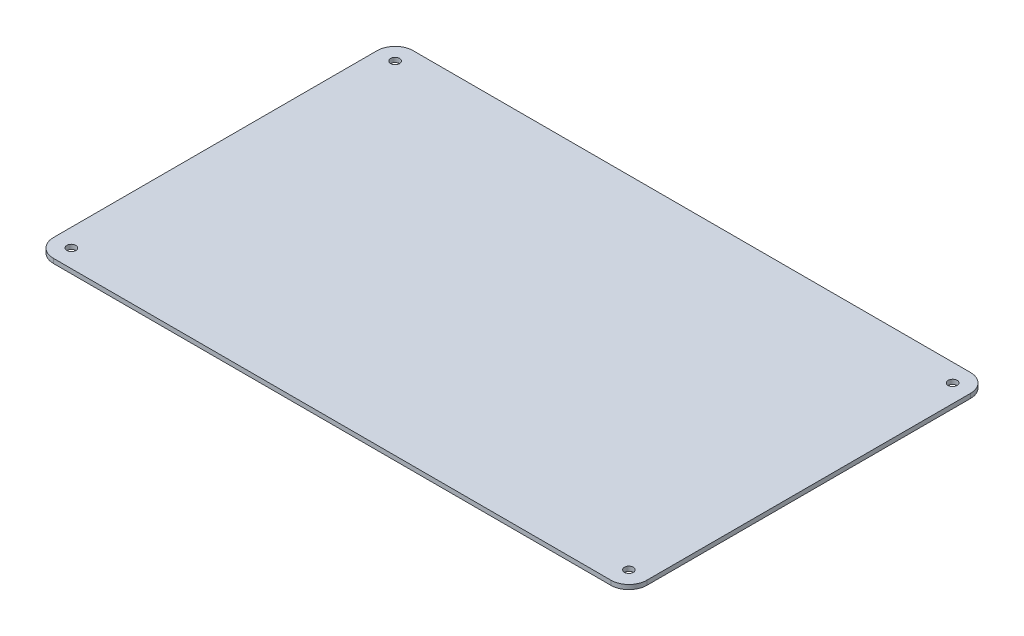
ISO-10303-21;
HEADER;
FILE_DESCRIPTION(('STEP AP214'),'2;1');
FILE_NAME('part.step','',(''),(''),'','','');
FILE_SCHEMA(('AUTOMOTIVE_DESIGN { 1 0 10303 214 1 1 1 1 }'));
ENDSEC;
DATA;
#1=APPLICATION_CONTEXT('core data for automotive mechanical design processes');
#2=APPLICATION_PROTOCOL_DEFINITION('international standard','automotive_design',2000,#1);
#3=PRODUCT_CONTEXT('',#1,'mechanical');
#4=PRODUCT('Part','Part','',(#3));
#5=PRODUCT_RELATED_PRODUCT_CATEGORY('part','',(#4));
#6=PRODUCT_DEFINITION_FORMATION('','',#4);
#7=PRODUCT_DEFINITION_CONTEXT('part definition',#1,'design');
#8=PRODUCT_DEFINITION('design','',#6,#7);
#9=PRODUCT_DEFINITION_SHAPE('','',#8);
#10=(LENGTH_UNIT() NAMED_UNIT(*) SI_UNIT(.MILLI.,.METRE.));
#11=(NAMED_UNIT(*) PLANE_ANGLE_UNIT() SI_UNIT($,.RADIAN.));
#12=(NAMED_UNIT(*) SI_UNIT($,.STERADIAN.) SOLID_ANGLE_UNIT());
#13=UNCERTAINTY_MEASURE_WITH_UNIT(LENGTH_MEASURE(1.E-05),#10,'distance_accuracy_value','');
#14=(GEOMETRIC_REPRESENTATION_CONTEXT(3) GLOBAL_UNCERTAINTY_ASSIGNED_CONTEXT((#13)) GLOBAL_UNIT_ASSIGNED_CONTEXT((#10,
#11,#12)) REPRESENTATION_CONTEXT('',''));
#15=CARTESIAN_POINT('',(0.,0.,0.));
#16=DIRECTION('',(0.,0.,1.));
#17=DIRECTION('',(1.,0.,0.));
#18=AXIS2_PLACEMENT_3D('',#15,#16,#17);
#19=CARTESIAN_POINT('',(6.35,1.5875,-6.35));
#20=DIRECTION('',(0.,1.,0.));
#21=DIRECTION('',(0.,0.,1.));
#22=AXIS2_PLACEMENT_3D('',#19,#20,#21);
#23=PLANE('',#22);
#24=CARTESIAN_POINT('',(203.2,1.5875,-6.35));
#25=DIRECTION('',(0.,1.,0.));
#26=DIRECTION('',(0.,0.,1.));
#27=AXIS2_PLACEMENT_3D('',#24,#25,#26);
#28=CIRCLE('',#27,1.58749999999999);
#29=CARTESIAN_POINT('',(203.2,1.5875,-4.76250000000002));
#30=VERTEX_POINT('',#29);
#31=EDGE_CURVE('E188',#30,#30,#28,.T.);
#32=ORIENTED_EDGE('',*,*,#31,.F.);
#33=EDGE_LOOP('',(#32));
#34=FACE_BOUND('',#33,.T.);
#35=CARTESIAN_POINT('',(6.35,1.5875,-120.65));
#36=DIRECTION('',(0.,1.,0.));
#37=DIRECTION('',(0.,0.,1.));
#38=AXIS2_PLACEMENT_3D('',#35,#36,#37);
#39=CIRCLE('',#38,1.5875);
#40=CARTESIAN_POINT('',(6.35,1.5875,-119.0625));
#41=VERTEX_POINT('',#40);
#42=EDGE_CURVE('E134',#41,#41,#39,.T.);
#43=ORIENTED_EDGE('',*,*,#42,.F.);
#44=EDGE_LOOP('',(#43));
#45=FACE_BOUND('',#44,.T.);
#46=CARTESIAN_POINT('',(6.35,1.5875,-6.35));
#47=DIRECTION('',(0.,1.,0.));
#48=DIRECTION('',(0.,0.,1.));
#49=AXIS2_PLACEMENT_3D('',#46,#47,#48);
#50=CIRCLE('',#49,6.35);
#51=CARTESIAN_POINT('',(0.,1.5875,-6.35000000000004));
#52=VERTEX_POINT('',#51);
#53=CARTESIAN_POINT('',(6.35000000000004,1.5875,0.));
#54=VERTEX_POINT('',#53);
#55=EDGE_CURVE('E145',#52,#54,#50,.T.);
#56=ORIENTED_EDGE('',*,*,#55,.T.);
#57=DIRECTION('',(1.,0.,0.));
#58=VECTOR('',#57,1.);
#59=CARTESIAN_POINT('',(6.35000000000004,1.5875,0.));
#60=LINE('',#59,#58);
#61=CARTESIAN_POINT('',(203.2,1.5875,0.));
#62=VERTEX_POINT('',#61);
#63=EDGE_CURVE('E93',#54,#62,#60,.T.);
#64=ORIENTED_EDGE('',*,*,#63,.T.);
#65=CARTESIAN_POINT('',(203.2,1.5875,-6.35));
#66=DIRECTION('',(0.,1.,0.));
#67=DIRECTION('',(0.,0.,1.));
#68=AXIS2_PLACEMENT_3D('',#65,#66,#67);
#69=CIRCLE('',#68,6.35);
#70=CARTESIAN_POINT('',(209.55,1.5875,-6.35000000000004));
#71=VERTEX_POINT('',#70);
#72=EDGE_CURVE('E160',#62,#71,#69,.T.);
#73=ORIENTED_EDGE('',*,*,#72,.T.);
#74=DIRECTION('',(0.,0.,-1.));
#75=VECTOR('',#74,1.);
#76=CARTESIAN_POINT('',(209.55,1.5875,-6.35000000000004));
#77=LINE('',#76,#75);
#78=CARTESIAN_POINT('',(209.55,1.5875,-120.65));
#79=VERTEX_POINT('',#78);
#80=EDGE_CURVE('E173',#71,#79,#77,.T.);
#81=ORIENTED_EDGE('',*,*,#80,.T.);
#82=CARTESIAN_POINT('',(203.2,1.5875,-120.65));
#83=DIRECTION('',(0.,1.,0.));
#84=DIRECTION('',(0.,0.,1.));
#85=AXIS2_PLACEMENT_3D('',#82,#83,#84);
#86=CIRCLE('',#85,6.34999999999999);
#87=CARTESIAN_POINT('',(203.2,1.5875,-127.));
#88=VERTEX_POINT('',#87);
#89=EDGE_CURVE('E112',#79,#88,#86,.T.);
#90=ORIENTED_EDGE('',*,*,#89,.T.);
#91=DIRECTION('',(-1.,0.,0.));
#92=VECTOR('',#91,1.);
#93=CARTESIAN_POINT('',(6.35000000000004,1.5875,-127.));
#94=LINE('',#93,#92);
#95=CARTESIAN_POINT('',(6.35000000000005,1.5875,-127.));
#96=VERTEX_POINT('',#95);
#97=EDGE_CURVE('E106',#88,#96,#94,.T.);
#98=ORIENTED_EDGE('',*,*,#97,.T.);
#99=CARTESIAN_POINT('',(6.35,1.5875,-120.65));
#100=DIRECTION('',(0.,1.,0.));
#101=DIRECTION('',(0.,0.,1.));
#102=AXIS2_PLACEMENT_3D('',#99,#100,#101);
#103=CIRCLE('',#102,6.35);
#104=CARTESIAN_POINT('',(0.,1.5875,-120.65));
#105=VERTEX_POINT('',#104);
#106=EDGE_CURVE('E110',#96,#105,#103,.T.);
#107=ORIENTED_EDGE('',*,*,#106,.T.);
#108=DIRECTION('',(0.,0.,1.));
#109=VECTOR('',#108,1.);
#110=CARTESIAN_POINT('',(0.,1.5875,-6.35000000000004));
#111=LINE('',#110,#109);
#112=EDGE_CURVE('E50',#105,#52,#111,.T.);
#113=ORIENTED_EDGE('',*,*,#112,.T.);
#114=EDGE_LOOP('',(#56,#64,#73,#81,#90,#98,#107,#113));
#115=FACE_BOUND('',#114,.T.);
#116=CARTESIAN_POINT('',(203.2,1.5875,-120.65));
#117=DIRECTION('',(0.,1.,0.));
#118=DIRECTION('',(0.,0.,1.));
#119=AXIS2_PLACEMENT_3D('',#116,#117,#118);
#120=CIRCLE('',#119,1.58749999999999);
#121=CARTESIAN_POINT('',(203.2,1.5875,-119.0625));
#122=VERTEX_POINT('',#121);
#123=EDGE_CURVE('E182',#122,#122,#120,.T.);
#124=ORIENTED_EDGE('',*,*,#123,.F.);
#125=EDGE_LOOP('',(#124));
#126=FACE_BOUND('',#125,.T.);
#127=CARTESIAN_POINT('',(6.35,1.5875,-6.35));
#128=DIRECTION('',(0.,1.,0.));
#129=DIRECTION('',(0.,0.,1.));
#130=AXIS2_PLACEMENT_3D('',#127,#128,#129);
#131=CIRCLE('',#130,1.5875);
#132=CARTESIAN_POINT('',(6.35,1.5875,-4.7625));
#133=VERTEX_POINT('',#132);
#134=EDGE_CURVE('E194',#133,#133,#131,.T.);
#135=ORIENTED_EDGE('',*,*,#134,.F.);
#136=EDGE_LOOP('',(#135));
#137=FACE_BOUND('',#136,.T.);
#138=ADVANCED_FACE('F33',(#34,#45,#115,#126,#137),#23,.T.);
#139=CARTESIAN_POINT('',(6.35,0.,-6.35));
#140=DIRECTION('',(0.,1.,0.));
#141=DIRECTION('',(0.,0.,1.));
#142=AXIS2_PLACEMENT_3D('',#139,#140,#141);
#143=PLANE('',#142);
#144=CARTESIAN_POINT('',(6.35,0.,-6.35));
#145=DIRECTION('',(0.,1.,0.));
#146=DIRECTION('',(0.,0.,1.));
#147=AXIS2_PLACEMENT_3D('',#144,#145,#146);
#148=CIRCLE('',#147,6.35);
#149=CARTESIAN_POINT('',(0.,0.,-6.35000000000004));
#150=VERTEX_POINT('',#149);
#151=CARTESIAN_POINT('',(6.35000000000004,0.,0.));
#152=VERTEX_POINT('',#151);
#153=EDGE_CURVE('E130',#150,#152,#148,.T.);
#154=ORIENTED_EDGE('',*,*,#153,.F.);
#155=DIRECTION('',(0.,0.,1.));
#156=VECTOR('',#155,1.);
#157=CARTESIAN_POINT('',(0.,0.,-6.35000000000004));
#158=LINE('',#157,#156);
#159=CARTESIAN_POINT('',(0.,0.,-120.65));
#160=VERTEX_POINT('',#159);
#161=EDGE_CURVE('E85',#160,#150,#158,.T.);
#162=ORIENTED_EDGE('',*,*,#161,.F.);
#163=CARTESIAN_POINT('',(6.35,0.,-120.65));
#164=DIRECTION('',(0.,1.,0.));
#165=DIRECTION('',(0.,0.,1.));
#166=AXIS2_PLACEMENT_3D('',#163,#164,#165);
#167=CIRCLE('',#166,6.35);
#168=CARTESIAN_POINT('',(6.35000000000005,0.,-127.));
#169=VERTEX_POINT('',#168);
#170=EDGE_CURVE('E79',#169,#160,#167,.T.);
#171=ORIENTED_EDGE('',*,*,#170,.F.);
#172=DIRECTION('',(-1.,0.,0.));
#173=VECTOR('',#172,1.);
#174=CARTESIAN_POINT('',(6.35000000000004,0.,-127.));
#175=LINE('',#174,#173);
#176=CARTESIAN_POINT('',(203.2,0.,-127.));
#177=VERTEX_POINT('',#176);
#178=EDGE_CURVE('E120',#177,#169,#175,.T.);
#179=ORIENTED_EDGE('',*,*,#178,.F.);
#180=CARTESIAN_POINT('',(203.2,0.,-120.65));
#181=DIRECTION('',(0.,1.,0.));
#182=DIRECTION('',(0.,0.,1.));
#183=AXIS2_PLACEMENT_3D('',#180,#181,#182);
#184=CIRCLE('',#183,6.34999999999999);
#185=CARTESIAN_POINT('',(209.55,0.,-120.65));
#186=VERTEX_POINT('',#185);
#187=EDGE_CURVE('E140',#186,#177,#184,.T.);
#188=ORIENTED_EDGE('',*,*,#187,.F.);
#189=DIRECTION('',(0.,0.,-1.));
#190=VECTOR('',#189,1.);
#191=CARTESIAN_POINT('',(209.55,0.,-6.35000000000004));
#192=LINE('',#191,#190);
#193=CARTESIAN_POINT('',(209.55,0.,-6.35000000000004));
#194=VERTEX_POINT('',#193);
#195=EDGE_CURVE('E138',#194,#186,#192,.T.);
#196=ORIENTED_EDGE('',*,*,#195,.F.);
#197=CARTESIAN_POINT('',(203.2,0.,-6.35));
#198=DIRECTION('',(0.,1.,0.));
#199=DIRECTION('',(0.,0.,1.));
#200=AXIS2_PLACEMENT_3D('',#197,#198,#199);
#201=CIRCLE('',#200,6.35);
#202=CARTESIAN_POINT('',(203.2,0.,0.));
#203=VERTEX_POINT('',#202);
#204=EDGE_CURVE('E136',#203,#194,#201,.T.);
#205=ORIENTED_EDGE('',*,*,#204,.F.);
#206=DIRECTION('',(1.,0.,0.));
#207=VECTOR('',#206,1.);
#208=CARTESIAN_POINT('',(6.35000000000004,0.,0.));
#209=LINE('',#208,#207);
#210=EDGE_CURVE('E133',#152,#203,#209,.T.);
#211=ORIENTED_EDGE('',*,*,#210,.F.);
#212=EDGE_LOOP('',(#154,#162,#171,#179,#188,#196,#205,#211));
#213=FACE_BOUND('',#212,.T.);
#214=CARTESIAN_POINT('',(6.35,0.,-120.65));
#215=DIRECTION('',(0.,1.,0.));
#216=DIRECTION('',(0.,0.,1.));
#217=AXIS2_PLACEMENT_3D('',#214,#215,#216);
#218=CIRCLE('',#217,1.5875);
#219=CARTESIAN_POINT('',(6.35,0.,-119.0625));
#220=VERTEX_POINT('',#219);
#221=EDGE_CURVE('E179',#220,#220,#218,.T.);
#222=ORIENTED_EDGE('',*,*,#221,.T.);
#223=EDGE_LOOP('',(#222));
#224=FACE_BOUND('',#223,.T.);
#225=CARTESIAN_POINT('',(203.2,0.,-120.65));
#226=DIRECTION('',(0.,1.,0.));
#227=DIRECTION('',(0.,0.,1.));
#228=AXIS2_PLACEMENT_3D('',#225,#226,#227);
#229=CIRCLE('',#228,1.58749999999999);
#230=CARTESIAN_POINT('',(203.2,0.,-119.0625));
#231=VERTEX_POINT('',#230);
#232=EDGE_CURVE('E185',#231,#231,#229,.T.);
#233=ORIENTED_EDGE('',*,*,#232,.T.);
#234=EDGE_LOOP('',(#233));
#235=FACE_BOUND('',#234,.T.);
#236=CARTESIAN_POINT('',(203.2,0.,-6.35));
#237=DIRECTION('',(0.,1.,0.));
#238=DIRECTION('',(0.,0.,1.));
#239=AXIS2_PLACEMENT_3D('',#236,#237,#238);
#240=CIRCLE('',#239,1.58749999999999);
#241=CARTESIAN_POINT('',(203.2,0.,-4.76250000000002));
#242=VERTEX_POINT('',#241);
#243=EDGE_CURVE('E191',#242,#242,#240,.T.);
#244=ORIENTED_EDGE('',*,*,#243,.T.);
#245=EDGE_LOOP('',(#244));
#246=FACE_BOUND('',#245,.T.);
#247=CARTESIAN_POINT('',(6.35,0.,-6.35));
#248=DIRECTION('',(0.,1.,0.));
#249=DIRECTION('',(0.,0.,1.));
#250=AXIS2_PLACEMENT_3D('',#247,#248,#249);
#251=CIRCLE('',#250,1.5875);
#252=CARTESIAN_POINT('',(6.35,0.,-4.7625));
#253=VERTEX_POINT('',#252);
#254=EDGE_CURVE('E197',#253,#253,#251,.T.);
#255=ORIENTED_EDGE('',*,*,#254,.T.);
#256=EDGE_LOOP('',(#255));
#257=FACE_BOUND('',#256,.T.);
#258=ADVANCED_FACE('F164',(#213,#224,#235,#246,#257),#143,.F.);
#259=CARTESIAN_POINT('',(6.35,1.5875,-6.35));
#260=DIRECTION('',(0.,-1.,0.));
#261=DIRECTION('',(0.,0.,-1.));
#262=AXIS2_PLACEMENT_3D('',#259,#260,#261);
#263=CYLINDRICAL_SURFACE('',#262,6.35);
#264=ORIENTED_EDGE('',*,*,#153,.T.);
#265=DIRECTION('',(0.,-1.,0.));
#266=VECTOR('',#265,1.);
#267=CARTESIAN_POINT('',(6.35000000000004,1.5875,0.));
#268=LINE('',#267,#266);
#269=EDGE_CURVE('E11',#54,#152,#268,.T.);
#270=ORIENTED_EDGE('',*,*,#269,.F.);
#271=ORIENTED_EDGE('',*,*,#55,.F.);
#272=DIRECTION('',(0.,-1.,0.));
#273=VECTOR('',#272,1.);
#274=CARTESIAN_POINT('',(0.,1.5875,-6.35000000000004));
#275=LINE('',#274,#273);
#276=EDGE_CURVE('E126',#52,#150,#275,.T.);
#277=ORIENTED_EDGE('',*,*,#276,.T.);
#278=EDGE_LOOP('',(#264,#270,#271,#277));
#279=FACE_BOUND('',#278,.T.);
#280=ADVANCED_FACE('F35',(#279),#263,.T.);
#281=CARTESIAN_POINT('',(6.35000000000004,1.5875,0.));
#282=DIRECTION('',(0.,0.,-1.));
#283=DIRECTION('',(-1.,0.,0.));
#284=AXIS2_PLACEMENT_3D('',#281,#282,#283);
#285=PLANE('',#284);
#286=ORIENTED_EDGE('',*,*,#210,.T.);
#287=DIRECTION('',(0.,-1.,0.));
#288=VECTOR('',#287,1.);
#289=CARTESIAN_POINT('',(203.2,1.5875,0.));
#290=LINE('',#289,#288);
#291=EDGE_CURVE('E42',#62,#203,#290,.T.);
#292=ORIENTED_EDGE('',*,*,#291,.F.);
#293=ORIENTED_EDGE('',*,*,#63,.F.);
#294=ORIENTED_EDGE('',*,*,#269,.T.);
#295=EDGE_LOOP('',(#286,#292,#293,#294));
#296=FACE_BOUND('',#295,.T.);
#297=ADVANCED_FACE('F231',(#296),#285,.F.);
#298=CARTESIAN_POINT('',(203.2,1.5875,-6.35));
#299=DIRECTION('',(0.,-1.,0.));
#300=DIRECTION('',(0.,0.,-1.));
#301=AXIS2_PLACEMENT_3D('',#298,#299,#300);
#302=CYLINDRICAL_SURFACE('',#301,6.35);
#303=ORIENTED_EDGE('',*,*,#204,.T.);
#304=DIRECTION('',(0.,-1.,0.));
#305=VECTOR('',#304,1.);
#306=CARTESIAN_POINT('',(209.55,1.5875,-6.35000000000004));
#307=LINE('',#306,#305);
#308=EDGE_CURVE('E152',#71,#194,#307,.T.);
#309=ORIENTED_EDGE('',*,*,#308,.F.);
#310=ORIENTED_EDGE('',*,*,#72,.F.);
#311=ORIENTED_EDGE('',*,*,#291,.T.);
#312=EDGE_LOOP('',(#303,#309,#310,#311));
#313=FACE_BOUND('',#312,.T.);
#314=ADVANCED_FACE('F158',(#313),#302,.T.);
#315=CARTESIAN_POINT('',(209.55,1.5875,-6.35000000000004));
#316=DIRECTION('',(-1.,0.,0.));
#317=DIRECTION('',(0.,0.,1.));
#318=AXIS2_PLACEMENT_3D('',#315,#316,#317);
#319=PLANE('',#318);
#320=ORIENTED_EDGE('',*,*,#195,.T.);
#321=DIRECTION('',(0.,-1.,0.));
#322=VECTOR('',#321,1.);
#323=CARTESIAN_POINT('',(209.55,1.5875,-120.65));
#324=LINE('',#323,#322);
#325=EDGE_CURVE('E149',#79,#186,#324,.T.);
#326=ORIENTED_EDGE('',*,*,#325,.F.);
#327=ORIENTED_EDGE('',*,*,#80,.F.);
#328=ORIENTED_EDGE('',*,*,#308,.T.);
#329=EDGE_LOOP('',(#320,#326,#327,#328));
#330=FACE_BOUND('',#329,.T.);
#331=ADVANCED_FACE('F169',(#330),#319,.F.);
#332=CARTESIAN_POINT('',(203.2,1.5875,-120.65));
#333=DIRECTION('',(0.,-1.,0.));
#334=DIRECTION('',(0.,0.,-1.));
#335=AXIS2_PLACEMENT_3D('',#332,#333,#334);
#336=CYLINDRICAL_SURFACE('',#335,6.34999999999999);
#337=ORIENTED_EDGE('',*,*,#187,.T.);
#338=DIRECTION('',(0.,-1.,0.));
#339=VECTOR('',#338,1.);
#340=CARTESIAN_POINT('',(203.2,1.5875,-127.));
#341=LINE('',#340,#339);
#342=EDGE_CURVE('E121',#88,#177,#341,.T.);
#343=ORIENTED_EDGE('',*,*,#342,.F.);
#344=ORIENTED_EDGE('',*,*,#89,.F.);
#345=ORIENTED_EDGE('',*,*,#325,.T.);
#346=EDGE_LOOP('',(#337,#343,#344,#345));
#347=FACE_BOUND('',#346,.T.);
#348=ADVANCED_FACE('F172',(#347),#336,.T.);
#349=CARTESIAN_POINT('',(6.35000000000004,1.5875,-127.));
#350=DIRECTION('',(0.,0.,1.));
#351=DIRECTION('',(1.,0.,0.));
#352=AXIS2_PLACEMENT_3D('',#349,#350,#351);
#353=PLANE('',#352);
#354=ORIENTED_EDGE('',*,*,#178,.T.);
#355=DIRECTION('',(0.,-1.,0.));
#356=VECTOR('',#355,1.);
#357=CARTESIAN_POINT('',(6.35000000000005,1.5875,-127.));
#358=LINE('',#357,#356);
#359=EDGE_CURVE('E117',#96,#169,#358,.T.);
#360=ORIENTED_EDGE('',*,*,#359,.F.);
#361=ORIENTED_EDGE('',*,*,#97,.F.);
#362=ORIENTED_EDGE('',*,*,#342,.T.);
#363=EDGE_LOOP('',(#354,#360,#361,#362));
#364=FACE_BOUND('',#363,.T.);
#365=ADVANCED_FACE('F118',(#364),#353,.F.);
#366=CARTESIAN_POINT('',(6.35,1.5875,-120.65));
#367=DIRECTION('',(0.,-1.,0.));
#368=DIRECTION('',(0.,0.,-1.));
#369=AXIS2_PLACEMENT_3D('',#366,#367,#368);
#370=CYLINDRICAL_SURFACE('',#369,6.35);
#371=ORIENTED_EDGE('',*,*,#170,.T.);
#372=DIRECTION('',(0.,-1.,0.));
#373=VECTOR('',#372,1.);
#374=CARTESIAN_POINT('',(0.,1.5875,-120.65));
#375=LINE('',#374,#373);
#376=EDGE_CURVE('E122',#105,#160,#375,.T.);
#377=ORIENTED_EDGE('',*,*,#376,.F.);
#378=ORIENTED_EDGE('',*,*,#106,.F.);
#379=ORIENTED_EDGE('',*,*,#359,.T.);
#380=EDGE_LOOP('',(#371,#377,#378,#379));
#381=FACE_BOUND('',#380,.T.);
#382=ADVANCED_FACE('F124',(#381),#370,.T.);
#383=CARTESIAN_POINT('',(0.,1.5875,-6.35000000000004));
#384=DIRECTION('',(1.,0.,0.));
#385=DIRECTION('',(0.,0.,-1.));
#386=AXIS2_PLACEMENT_3D('',#383,#384,#385);
#387=PLANE('',#386);
#388=ORIENTED_EDGE('',*,*,#161,.T.);
#389=ORIENTED_EDGE('',*,*,#276,.F.);
#390=ORIENTED_EDGE('',*,*,#112,.F.);
#391=ORIENTED_EDGE('',*,*,#376,.T.);
#392=EDGE_LOOP('',(#388,#389,#390,#391));
#393=FACE_BOUND('',#392,.T.);
#394=ADVANCED_FACE('F219',(#393),#387,.F.);
#395=CARTESIAN_POINT('',(6.35,1.5875,-120.65));
#396=DIRECTION('',(0.,-1.,0.));
#397=DIRECTION('',(0.,0.,-1.));
#398=AXIS2_PLACEMENT_3D('',#395,#396,#397);
#399=CYLINDRICAL_SURFACE('',#398,1.5875);
#400=ORIENTED_EDGE('',*,*,#42,.T.);
#401=EDGE_LOOP('',(#400));
#402=FACE_BOUND('',#401,.T.);
#403=ORIENTED_EDGE('',*,*,#221,.F.);
#404=EDGE_LOOP('',(#403));
#405=FACE_BOUND('',#404,.T.);
#406=ADVANCED_FACE('F216',(#402,#405),#399,.F.);
#407=CARTESIAN_POINT('',(203.2,1.5875,-120.65));
#408=DIRECTION('',(0.,-1.,0.));
#409=DIRECTION('',(0.,0.,-1.));
#410=AXIS2_PLACEMENT_3D('',#407,#408,#409);
#411=CYLINDRICAL_SURFACE('',#410,1.58749999999999);
#412=ORIENTED_EDGE('',*,*,#123,.T.);
#413=EDGE_LOOP('',(#412));
#414=FACE_BOUND('',#413,.T.);
#415=ORIENTED_EDGE('',*,*,#232,.F.);
#416=EDGE_LOOP('',(#415));
#417=FACE_BOUND('',#416,.T.);
#418=ADVANCED_FACE('F295',(#414,#417),#411,.F.);
#419=CARTESIAN_POINT('',(203.2,1.5875,-6.35));
#420=DIRECTION('',(0.,-1.,0.));
#421=DIRECTION('',(0.,0.,-1.));
#422=AXIS2_PLACEMENT_3D('',#419,#420,#421);
#423=CYLINDRICAL_SURFACE('',#422,1.58749999999999);
#424=ORIENTED_EDGE('',*,*,#31,.T.);
#425=EDGE_LOOP('',(#424));
#426=FACE_BOUND('',#425,.T.);
#427=ORIENTED_EDGE('',*,*,#243,.F.);
#428=EDGE_LOOP('',(#427));
#429=FACE_BOUND('',#428,.T.);
#430=ADVANCED_FACE('F303',(#426,#429),#423,.F.);
#431=CARTESIAN_POINT('',(6.35,1.5875,-6.35));
#432=DIRECTION('',(0.,-1.,0.));
#433=DIRECTION('',(0.,0.,-1.));
#434=AXIS2_PLACEMENT_3D('',#431,#432,#433);
#435=CYLINDRICAL_SURFACE('',#434,1.5875);
#436=ORIENTED_EDGE('',*,*,#134,.T.);
#437=EDGE_LOOP('',(#436));
#438=FACE_BOUND('',#437,.T.);
#439=ORIENTED_EDGE('',*,*,#254,.F.);
#440=EDGE_LOOP('',(#439));
#441=FACE_BOUND('',#440,.T.);
#442=ADVANCED_FACE('F203',(#438,#441),#435,.F.);
#443=CLOSED_SHELL('',(#138,#258,#280,#297,#314,#331,#348,#365,#382,#394,#406,#418,#430,#442));
#444=MANIFOLD_SOLID_BREP('B2',#443);
#445=ADVANCED_BREP_SHAPE_REPRESENTATION('',(#18,#444),#14);
#446=SHAPE_DEFINITION_REPRESENTATION(#9,#445);
ENDSEC;
END-ISO-10303-21;
